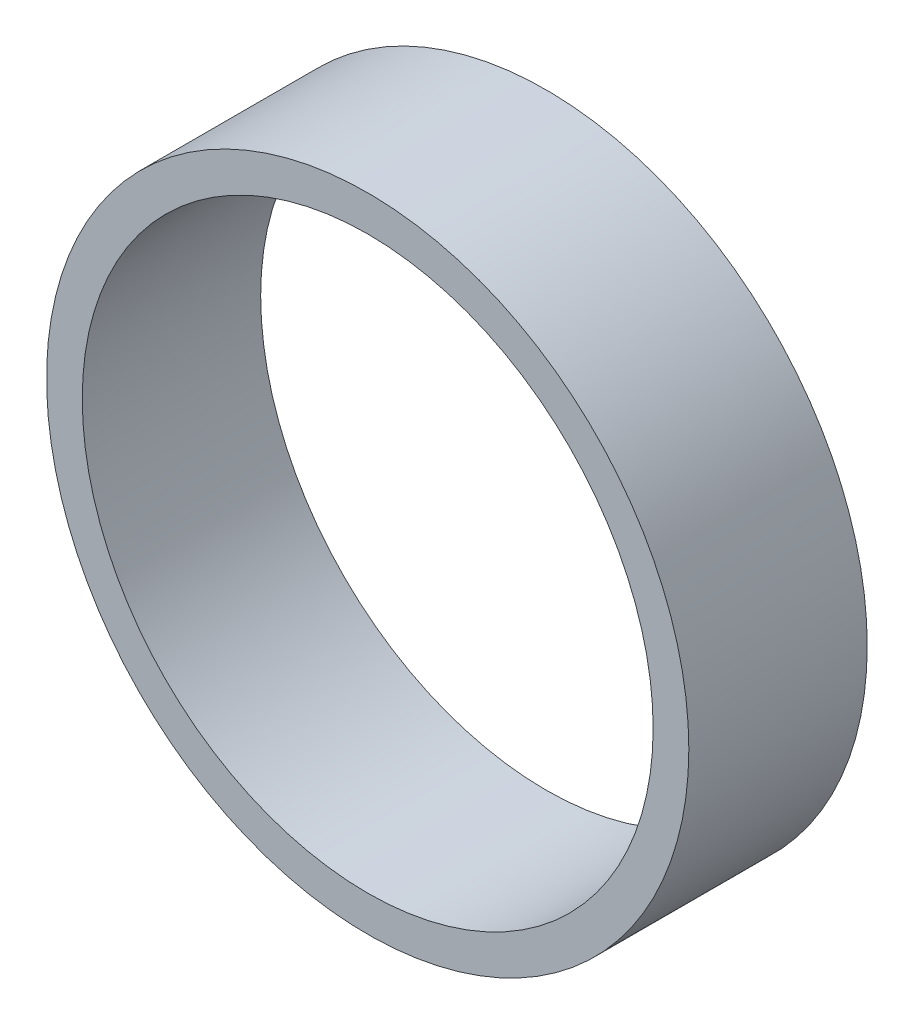
ISO-10303-21;
HEADER;
FILE_DESCRIPTION(('STEP AP214'),'2;1');
FILE_NAME('part.step','',(''),(''),'','','');
FILE_SCHEMA(('AUTOMOTIVE_DESIGN { 1 0 10303 214 1 1 1 1 }'));
ENDSEC;
DATA;
#1=APPLICATION_CONTEXT('core data for automotive mechanical design processes');
#2=APPLICATION_PROTOCOL_DEFINITION('international standard','automotive_design',2000,#1);
#3=PRODUCT_CONTEXT('',#1,'mechanical');
#4=PRODUCT('Part','Part','',(#3));
#5=PRODUCT_RELATED_PRODUCT_CATEGORY('part','',(#4));
#6=PRODUCT_DEFINITION_FORMATION('','',#4);
#7=PRODUCT_DEFINITION_CONTEXT('part definition',#1,'design');
#8=PRODUCT_DEFINITION('design','',#6,#7);
#9=PRODUCT_DEFINITION_SHAPE('','',#8);
#10=(LENGTH_UNIT() NAMED_UNIT(*) SI_UNIT(.MILLI.,.METRE.));
#11=(NAMED_UNIT(*) PLANE_ANGLE_UNIT() SI_UNIT($,.RADIAN.));
#12=(NAMED_UNIT(*) SI_UNIT($,.STERADIAN.) SOLID_ANGLE_UNIT());
#13=UNCERTAINTY_MEASURE_WITH_UNIT(LENGTH_MEASURE(1.E-05),#10,'distance_accuracy_value','');
#14=(GEOMETRIC_REPRESENTATION_CONTEXT(3) GLOBAL_UNCERTAINTY_ASSIGNED_CONTEXT((#13)) GLOBAL_UNIT_ASSIGNED_CONTEXT((#10,
#11,#12)) REPRESENTATION_CONTEXT('',''));
#15=CARTESIAN_POINT('',(0.,0.,0.));
#16=DIRECTION('',(0.,0.,1.));
#17=DIRECTION('',(1.,0.,0.));
#18=AXIS2_PLACEMENT_3D('',#15,#16,#17);
#19=CARTESIAN_POINT('',(0.,0.,1.));
#20=DIRECTION('',(0.,0.,1.));
#21=DIRECTION('',(1.,0.,0.));
#22=AXIS2_PLACEMENT_3D('',#19,#20,#21);
#23=PLANE('',#22);
#24=CARTESIAN_POINT('',(0.,0.,1.));
#25=DIRECTION('',(0.,0.,1.));
#26=DIRECTION('',(1.,0.,0.));
#27=AXIS2_PLACEMENT_3D('',#24,#25,#26);
#28=CIRCLE('',#27,1.8);
#29=CARTESIAN_POINT('',(1.8,0.,1.));
#30=VERTEX_POINT('',#29);
#31=EDGE_CURVE('E10',#30,#30,#28,.T.);
#32=ORIENTED_EDGE('',*,*,#31,.T.);
#33=EDGE_LOOP('',(#32));
#34=FACE_BOUND('',#33,.T.);
#35=CARTESIAN_POINT('',(0.,0.,1.));
#36=DIRECTION('',(0.,0.,1.));
#37=DIRECTION('',(1.,0.,0.));
#38=AXIS2_PLACEMENT_3D('',#35,#36,#37);
#39=CIRCLE('',#38,1.6);
#40=CARTESIAN_POINT('',(1.6,0.,1.));
#41=VERTEX_POINT('',#40);
#42=EDGE_CURVE('E42',#41,#41,#39,.T.);
#43=ORIENTED_EDGE('',*,*,#42,.F.);
#44=EDGE_LOOP('',(#43));
#45=FACE_BOUND('',#44,.T.);
#46=ADVANCED_FACE('F31',(#34,#45),#23,.T.);
#47=CARTESIAN_POINT('',(0.,0.,0.));
#48=DIRECTION('',(0.,0.,1.));
#49=DIRECTION('',(1.,0.,0.));
#50=AXIS2_PLACEMENT_3D('',#47,#48,#49);
#51=PLANE('',#50);
#52=CARTESIAN_POINT('',(0.,0.,0.));
#53=DIRECTION('',(0.,0.,1.));
#54=DIRECTION('',(1.,0.,0.));
#55=AXIS2_PLACEMENT_3D('',#52,#53,#54);
#56=CIRCLE('',#55,1.8);
#57=CARTESIAN_POINT('',(1.8,0.,0.));
#58=VERTEX_POINT('',#57);
#59=EDGE_CURVE('E35',#58,#58,#56,.T.);
#60=ORIENTED_EDGE('',*,*,#59,.F.);
#61=EDGE_LOOP('',(#60));
#62=FACE_BOUND('',#61,.T.);
#63=CARTESIAN_POINT('',(0.,0.,0.));
#64=DIRECTION('',(0.,0.,1.));
#65=DIRECTION('',(1.,0.,0.));
#66=AXIS2_PLACEMENT_3D('',#63,#64,#65);
#67=CIRCLE('',#66,1.6);
#68=CARTESIAN_POINT('',(1.6,0.,0.));
#69=VERTEX_POINT('',#68);
#70=EDGE_CURVE('E44',#69,#69,#67,.T.);
#71=ORIENTED_EDGE('',*,*,#70,.T.);
#72=EDGE_LOOP('',(#71));
#73=FACE_BOUND('',#72,.T.);
#74=ADVANCED_FACE('F54',(#62,#73),#51,.F.);
#75=CARTESIAN_POINT('',(0.,0.,1.));
#76=DIRECTION('',(0.,0.,-1.));
#77=DIRECTION('',(-1.,0.,0.));
#78=AXIS2_PLACEMENT_3D('',#75,#76,#77);
#79=CYLINDRICAL_SURFACE('',#78,1.8);
#80=ORIENTED_EDGE('',*,*,#31,.F.);
#81=EDGE_LOOP('',(#80));
#82=FACE_BOUND('',#81,.T.);
#83=ORIENTED_EDGE('',*,*,#59,.T.);
#84=EDGE_LOOP('',(#83));
#85=FACE_BOUND('',#84,.T.);
#86=ADVANCED_FACE('F33',(#82,#85),#79,.T.);
#87=CARTESIAN_POINT('',(0.,0.,1.));
#88=DIRECTION('',(0.,0.,-1.));
#89=DIRECTION('',(-1.,0.,0.));
#90=AXIS2_PLACEMENT_3D('',#87,#88,#89);
#91=CYLINDRICAL_SURFACE('',#90,1.6);
#92=ORIENTED_EDGE('',*,*,#42,.T.);
#93=EDGE_LOOP('',(#92));
#94=FACE_BOUND('',#93,.T.);
#95=ORIENTED_EDGE('',*,*,#70,.F.);
#96=EDGE_LOOP('',(#95));
#97=FACE_BOUND('',#96,.T.);
#98=ADVANCED_FACE('F50',(#94,#97),#91,.F.);
#99=CLOSED_SHELL('',(#46,#74,#86,#98));
#100=MANIFOLD_SOLID_BREP('B2',#99);
#101=ADVANCED_BREP_SHAPE_REPRESENTATION('',(#18,#100),#14);
#102=SHAPE_DEFINITION_REPRESENTATION(#9,#101);
ENDSEC;
END-ISO-10303-21;
